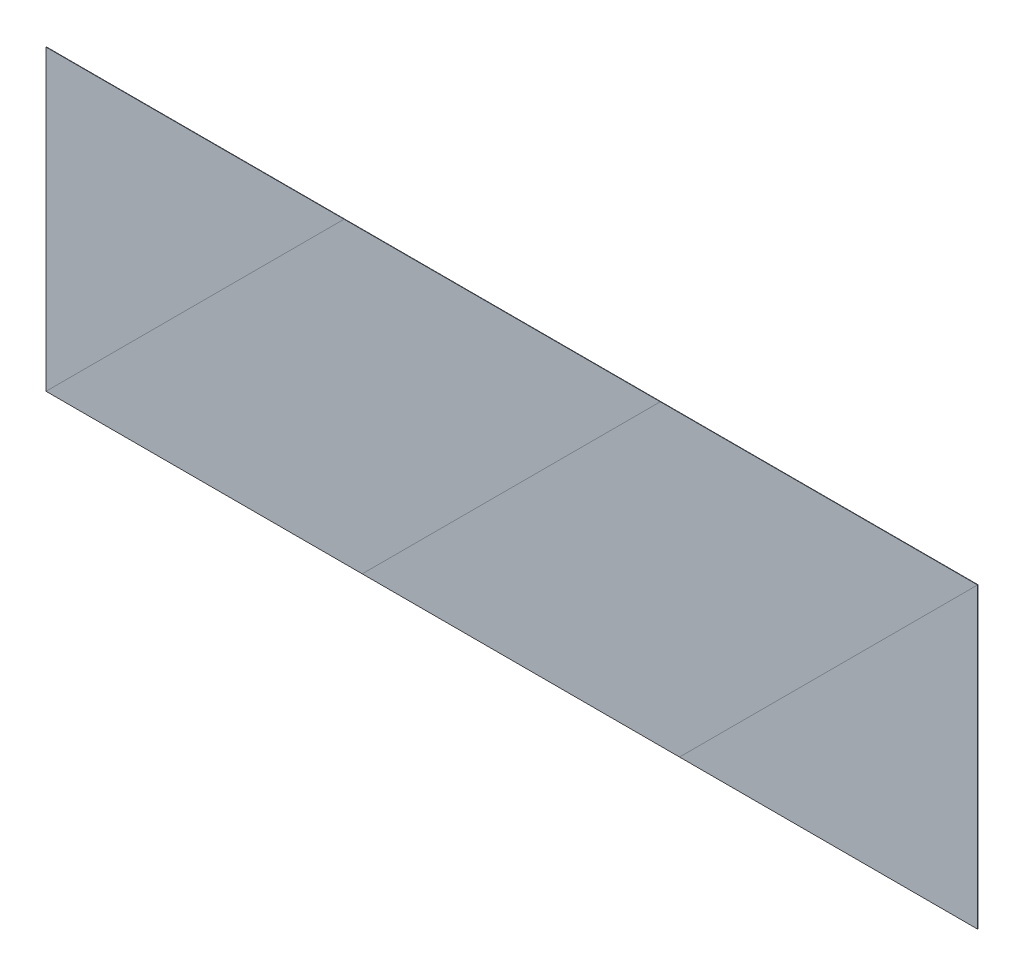
ISO-10303-21;
HEADER;
FILE_DESCRIPTION(('STEP AP214'),'2;1');
FILE_NAME('part.step','',(''),(''),'','','');
FILE_SCHEMA(('AUTOMOTIVE_DESIGN { 1 0 10303 214 1 1 1 1 }'));
ENDSEC;
DATA;
#1=APPLICATION_CONTEXT('core data for automotive mechanical design processes');
#2=APPLICATION_PROTOCOL_DEFINITION('international standard','automotive_design',2000,#1);
#3=PRODUCT_CONTEXT('',#1,'mechanical');
#4=PRODUCT('Part','Part','',(#3));
#5=PRODUCT_RELATED_PRODUCT_CATEGORY('part','',(#4));
#6=PRODUCT_DEFINITION_FORMATION('','',#4);
#7=PRODUCT_DEFINITION_CONTEXT('part definition',#1,'design');
#8=PRODUCT_DEFINITION('design','',#6,#7);
#9=PRODUCT_DEFINITION_SHAPE('','',#8);
#10=(LENGTH_UNIT() NAMED_UNIT(*) SI_UNIT(.MILLI.,.METRE.));
#11=(NAMED_UNIT(*) PLANE_ANGLE_UNIT() SI_UNIT($,.RADIAN.));
#12=(NAMED_UNIT(*) SI_UNIT($,.STERADIAN.) SOLID_ANGLE_UNIT());
#13=UNCERTAINTY_MEASURE_WITH_UNIT(LENGTH_MEASURE(1.E-05),#10,'distance_accuracy_value','');
#14=(GEOMETRIC_REPRESENTATION_CONTEXT(3) GLOBAL_UNCERTAINTY_ASSIGNED_CONTEXT((#13)) GLOBAL_UNIT_ASSIGNED_CONTEXT((#10,
#11,#12)) REPRESENTATION_CONTEXT('',''));
#15=CARTESIAN_POINT('',(0.,0.,0.));
#16=DIRECTION('',(0.,0.,1.));
#17=DIRECTION('',(1.,0.,0.));
#18=AXIS2_PLACEMENT_3D('',#15,#16,#17);
#19=CARTESIAN_POINT('',(125.,40.,0.));
#20=DIRECTION('',(0.,0.,1.));
#21=DIRECTION('',(1.,0.,0.));
#22=AXIS2_PLACEMENT_3D('',#19,#20,#21);
#23=PLANE('',#22);
#24=DIRECTION('',(1.,0.,0.));
#25=VECTOR('',#24,1.);
#26=CARTESIAN_POINT('',(0.,80.,0.));
#27=LINE('',#26,#25);
#28=CARTESIAN_POINT('',(0.,80.,0.));
#29=VERTEX_POINT('',#28);
#30=CARTESIAN_POINT('',(250.,80.,0.));
#31=VERTEX_POINT('',#30);
#32=EDGE_CURVE('E11',#29,#31,#27,.T.);
#33=ORIENTED_EDGE('',*,*,#32,.T.);
#34=DIRECTION('',(0.,-1.,0.));
#35=VECTOR('',#34,1.);
#36=CARTESIAN_POINT('',(250.,80.,0.));
#37=LINE('',#36,#35);
#38=CARTESIAN_POINT('',(250.,0.,0.));
#39=VERTEX_POINT('',#38);
#40=EDGE_CURVE('E112',#31,#39,#37,.T.);
#41=ORIENTED_EDGE('',*,*,#40,.T.);
#42=DIRECTION('',(-1.,0.,0.));
#43=VECTOR('',#42,1.);
#44=CARTESIAN_POINT('',(250.,0.,0.));
#45=LINE('',#44,#43);
#46=CARTESIAN_POINT('',(0.,0.,0.));
#47=VERTEX_POINT('',#46);
#48=EDGE_CURVE('E133',#39,#47,#45,.T.);
#49=ORIENTED_EDGE('',*,*,#48,.T.);
#50=DIRECTION('',(0.,1.,0.));
#51=VECTOR('',#50,1.);
#52=CARTESIAN_POINT('',(0.,0.,0.));
#53=LINE('',#52,#51);
#54=EDGE_CURVE('E102',#47,#29,#53,.T.);
#55=ORIENTED_EDGE('',*,*,#54,.T.);
#56=EDGE_LOOP('',(#33,#41,#49,#55));
#57=FACE_BOUND('',#56,.T.);
#58=ADVANCED_FACE('F17',(#57),#23,.F.);
#59=CARTESIAN_POINT('',(125.,40.,0.1));
#60=DIRECTION('',(0.,0.,1.));
#61=DIRECTION('',(1.,0.,0.));
#62=AXIS2_PLACEMENT_3D('',#59,#60,#61);
#63=PLANE('',#62);
#64=DIRECTION('',(0.707106781177127,0.707106781195968,0.));
#65=VECTOR('',#64,1.);
#66=CARTESIAN_POINT('',(170.000000002132,0.,0.1));
#67=LINE('',#66,#65);
#68=CARTESIAN_POINT('',(170.000000002132,0.,0.1));
#69=VERTEX_POINT('',#68);
#70=CARTESIAN_POINT('',(250.,80.,0.1));
#71=VERTEX_POINT('',#70);
#72=EDGE_CURVE('E119',#69,#71,#67,.T.);
#73=ORIENTED_EDGE('',*,*,#72,.T.);
#74=DIRECTION('',(1.,0.,0.));
#75=VECTOR('',#74,1.);
#76=CARTESIAN_POINT('',(164.852813741061,80.,0.1));
#77=LINE('',#76,#75);
#78=CARTESIAN_POINT('',(164.852813741061,80.,0.1));
#79=VERTEX_POINT('',#78);
#80=EDGE_CURVE('E28',#79,#71,#77,.T.);
#81=ORIENTED_EDGE('',*,*,#80,.F.);
#82=DIRECTION('',(-0.70710678118193,-0.707106781191166,0.));
#83=VECTOR('',#82,1.);
#84=CARTESIAN_POINT('',(164.852813741061,80.,0.1));
#85=LINE('',#84,#83);
#86=CARTESIAN_POINT('',(84.852813742106,0.,0.1));
#87=VERTEX_POINT('',#86);
#88=EDGE_CURVE('E123',#79,#87,#85,.T.);
#89=ORIENTED_EDGE('',*,*,#88,.T.);
#90=DIRECTION('',(-1.,0.,0.));
#91=VECTOR('',#90,1.);
#92=CARTESIAN_POINT('',(170.000000002132,0.,0.1));
#93=LINE('',#92,#91);
#94=EDGE_CURVE('E114',#69,#87,#93,.T.);
#95=ORIENTED_EDGE('',*,*,#94,.F.);
#96=EDGE_LOOP('',(#73,#81,#89,#95));
#97=FACE_BOUND('',#96,.T.);
#98=ADVANCED_FACE('F19',(#97),#63,.T.);
#99=CARTESIAN_POINT('',(0.,80.,0.));
#100=DIRECTION('',(0.,1.,0.));
#101=DIRECTION('',(1.,0.,0.));
#102=AXIS2_PLACEMENT_3D('',#99,#100,#101);
#103=PLANE('',#102);
#104=DIRECTION('',(1.,0.,0.));
#105=VECTOR('',#104,1.);
#106=CARTESIAN_POINT('',(0.,80.,0.1));
#107=LINE('',#106,#105);
#108=CARTESIAN_POINT('',(0.,80.,0.1));
#109=VERTEX_POINT('',#108);
#110=CARTESIAN_POINT('',(79.9999999994726,80.,0.1));
#111=VERTEX_POINT('',#110);
#112=EDGE_CURVE('E72',#109,#111,#107,.T.);
#113=ORIENTED_EDGE('',*,*,#112,.T.);
#114=DIRECTION('',(1.,0.,0.));
#115=VECTOR('',#114,1.);
#116=CARTESIAN_POINT('',(79.9999999994726,80.,0.1));
#117=LINE('',#116,#115);
#118=EDGE_CURVE('E96',#111,#79,#117,.T.);
#119=ORIENTED_EDGE('',*,*,#118,.T.);
#120=ORIENTED_EDGE('',*,*,#80,.T.);
#121=DIRECTION('',(0.,0.,1.));
#122=VECTOR('',#121,1.);
#123=CARTESIAN_POINT('',(250.,80.,0.));
#124=LINE('',#123,#122);
#125=EDGE_CURVE('E93',#31,#71,#124,.T.);
#126=ORIENTED_EDGE('',*,*,#125,.F.);
#127=ORIENTED_EDGE('',*,*,#32,.F.);
#128=DIRECTION('',(0.,0.,1.));
#129=VECTOR('',#128,1.);
#130=CARTESIAN_POINT('',(0.,80.,0.));
#131=LINE('',#130,#129);
#132=EDGE_CURVE('E142',#29,#109,#131,.T.);
#133=ORIENTED_EDGE('',*,*,#132,.T.);
#134=EDGE_LOOP('',(#113,#119,#120,#126,#127,#133));
#135=FACE_BOUND('',#134,.T.);
#136=ADVANCED_FACE('F92',(#135),#103,.T.);
#137=CARTESIAN_POINT('',(0.,0.,0.));
#138=DIRECTION('',(-1.,0.,0.));
#139=DIRECTION('',(0.,0.,1.));
#140=AXIS2_PLACEMENT_3D('',#137,#138,#139);
#141=PLANE('',#140);
#142=DIRECTION('',(0.,1.,0.));
#143=VECTOR('',#142,1.);
#144=CARTESIAN_POINT('',(0.,0.,0.1));
#145=LINE('',#144,#143);
#146=CARTESIAN_POINT('',(0.,0.,0.1));
#147=VERTEX_POINT('',#146);
#148=EDGE_CURVE('E21',#147,#109,#145,.T.);
#149=ORIENTED_EDGE('',*,*,#148,.T.);
#150=ORIENTED_EDGE('',*,*,#132,.F.);
#151=ORIENTED_EDGE('',*,*,#54,.F.);
#152=DIRECTION('',(0.,0.,1.));
#153=VECTOR('',#152,1.);
#154=CARTESIAN_POINT('',(0.,0.,0.));
#155=LINE('',#154,#153);
#156=EDGE_CURVE('E83',#47,#147,#155,.T.);
#157=ORIENTED_EDGE('',*,*,#156,.T.);
#158=EDGE_LOOP('',(#149,#150,#151,#157));
#159=FACE_BOUND('',#158,.T.);
#160=ADVANCED_FACE('F218',(#159),#141,.T.);
#161=CARTESIAN_POINT('',(250.,0.,0.));
#162=DIRECTION('',(0.,-1.,0.));
#163=DIRECTION('',(0.,0.,-1.));
#164=AXIS2_PLACEMENT_3D('',#161,#162,#163);
#165=PLANE('',#164);
#166=DIRECTION('',(-1.,0.,0.));
#167=VECTOR('',#166,1.);
#168=CARTESIAN_POINT('',(250.,0.,0.1));
#169=LINE('',#168,#167);
#170=CARTESIAN_POINT('',(250.,0.,0.1));
#171=VERTEX_POINT('',#170);
#172=EDGE_CURVE('E121',#171,#69,#169,.T.);
#173=ORIENTED_EDGE('',*,*,#172,.T.);
#174=ORIENTED_EDGE('',*,*,#94,.T.);
#175=DIRECTION('',(-1.,0.,0.));
#176=VECTOR('',#175,1.);
#177=CARTESIAN_POINT('',(84.852813742106,0.,0.1));
#178=LINE('',#177,#176);
#179=EDGE_CURVE('E136',#87,#147,#178,.T.);
#180=ORIENTED_EDGE('',*,*,#179,.T.);
#181=ORIENTED_EDGE('',*,*,#156,.F.);
#182=ORIENTED_EDGE('',*,*,#48,.F.);
#183=DIRECTION('',(0.,0.,1.));
#184=VECTOR('',#183,1.);
#185=CARTESIAN_POINT('',(250.,0.,0.));
#186=LINE('',#185,#184);
#187=EDGE_CURVE('E163',#39,#171,#186,.T.);
#188=ORIENTED_EDGE('',*,*,#187,.T.);
#189=EDGE_LOOP('',(#173,#174,#180,#181,#182,#188));
#190=FACE_BOUND('',#189,.T.);
#191=ADVANCED_FACE('F224',(#190),#165,.T.);
#192=CARTESIAN_POINT('',(250.,80.,0.));
#193=DIRECTION('',(1.,0.,0.));
#194=DIRECTION('',(0.,1.,0.));
#195=AXIS2_PLACEMENT_3D('',#192,#193,#194);
#196=PLANE('',#195);
#197=DIRECTION('',(0.,-1.,0.));
#198=VECTOR('',#197,1.);
#199=CARTESIAN_POINT('',(250.,80.,0.1));
#200=LINE('',#199,#198);
#201=EDGE_CURVE('E109',#71,#171,#200,.T.);
#202=ORIENTED_EDGE('',*,*,#201,.T.);
#203=ORIENTED_EDGE('',*,*,#187,.F.);
#204=ORIENTED_EDGE('',*,*,#40,.F.);
#205=ORIENTED_EDGE('',*,*,#125,.T.);
#206=EDGE_LOOP('',(#202,#203,#204,#205));
#207=FACE_BOUND('',#206,.T.);
#208=ADVANCED_FACE('F107',(#207),#196,.T.);
#209=CARTESIAN_POINT('',(125.,40.,0.1));
#210=DIRECTION('',(0.,0.,1.));
#211=DIRECTION('',(1.,0.,0.));
#212=AXIS2_PLACEMENT_3D('',#209,#210,#211);
#213=PLANE('',#212);
#214=DIRECTION('',(-0.707106781184217,-0.707106781188878,0.));
#215=VECTOR('',#214,1.);
#216=CARTESIAN_POINT('',(79.9999999994726,80.,0.1));
#217=LINE('',#216,#215);
#218=EDGE_CURVE('E140',#111,#147,#217,.T.);
#219=ORIENTED_EDGE('',*,*,#218,.F.);
#220=ORIENTED_EDGE('',*,*,#112,.F.);
#221=ORIENTED_EDGE('',*,*,#148,.F.);
#222=EDGE_LOOP('',(#219,#220,#221));
#223=FACE_BOUND('',#222,.T.);
#224=ADVANCED_FACE('F233',(#223),#213,.T.);
#225=CARTESIAN_POINT('',(125.,40.,0.1));
#226=DIRECTION('',(0.,0.,1.));
#227=DIRECTION('',(1.,0.,0.));
#228=AXIS2_PLACEMENT_3D('',#225,#226,#227);
#229=PLANE('',#228);
#230=ORIENTED_EDGE('',*,*,#88,.F.);
#231=ORIENTED_EDGE('',*,*,#118,.F.);
#232=ORIENTED_EDGE('',*,*,#218,.T.);
#233=ORIENTED_EDGE('',*,*,#179,.F.);
#234=EDGE_LOOP('',(#230,#231,#232,#233));
#235=FACE_BOUND('',#234,.T.);
#236=ADVANCED_FACE('F238',(#235),#229,.T.);
#237=CARTESIAN_POINT('',(125.,40.,0.1));
#238=DIRECTION('',(0.,0.,1.));
#239=DIRECTION('',(1.,0.,0.));
#240=AXIS2_PLACEMENT_3D('',#237,#238,#239);
#241=PLANE('',#240);
#242=ORIENTED_EDGE('',*,*,#72,.F.);
#243=ORIENTED_EDGE('',*,*,#172,.F.);
#244=ORIENTED_EDGE('',*,*,#201,.F.);
#245=EDGE_LOOP('',(#242,#243,#244));
#246=FACE_BOUND('',#245,.T.);
#247=ADVANCED_FACE('F118',(#246),#241,.T.);
#248=CLOSED_SHELL('',(#58,#98,#136,#160,#191,#208,#224,#236,#247));
#249=MANIFOLD_SOLID_BREP('B1',#248);
#250=ADVANCED_BREP_SHAPE_REPRESENTATION('',(#18,#249),#14);
#251=SHAPE_DEFINITION_REPRESENTATION(#9,#250);
ENDSEC;
END-ISO-10303-21;
